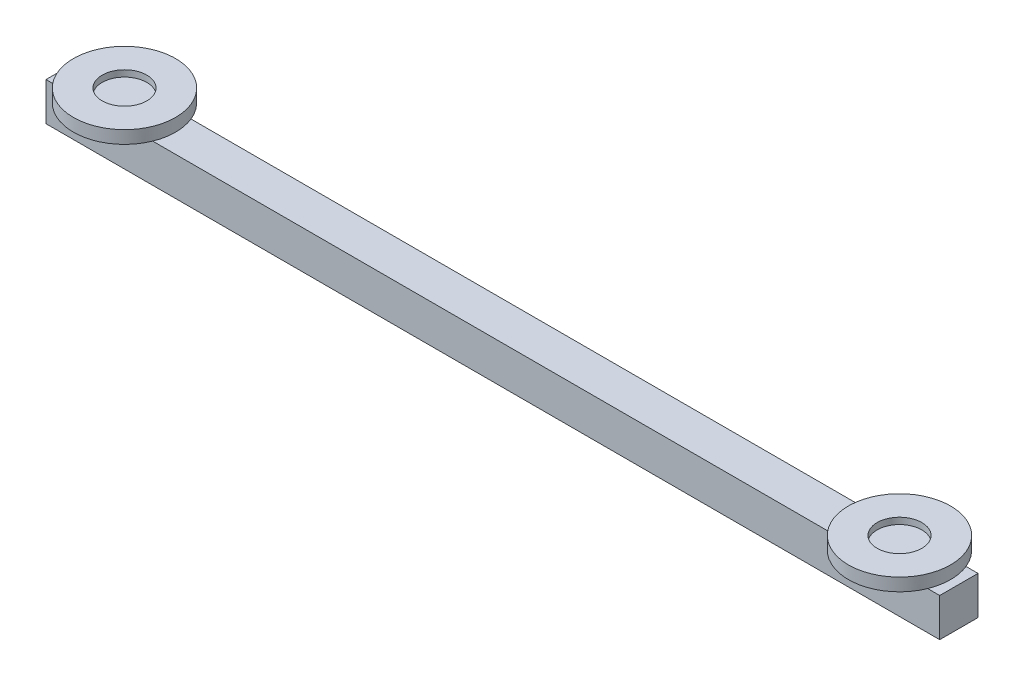
ISO-10303-21;
HEADER;
FILE_DESCRIPTION(('STEP AP214'),'2;1');
FILE_NAME('part.step','',(''),(''),'','','');
FILE_SCHEMA(('AUTOMOTIVE_DESIGN { 1 0 10303 214 1 1 1 1 }'));
ENDSEC;
DATA;
#1=APPLICATION_CONTEXT('core data for automotive mechanical design processes');
#2=APPLICATION_PROTOCOL_DEFINITION('international standard','automotive_design',2000,#1);
#3=PRODUCT_CONTEXT('',#1,'mechanical');
#4=PRODUCT('Part','Part','',(#3));
#5=PRODUCT_RELATED_PRODUCT_CATEGORY('part','',(#4));
#6=PRODUCT_DEFINITION_FORMATION('','',#4);
#7=PRODUCT_DEFINITION_CONTEXT('part definition',#1,'design');
#8=PRODUCT_DEFINITION('design','',#6,#7);
#9=PRODUCT_DEFINITION_SHAPE('','',#8);
#10=(LENGTH_UNIT() NAMED_UNIT(*) SI_UNIT(.MILLI.,.METRE.));
#11=(NAMED_UNIT(*) PLANE_ANGLE_UNIT() SI_UNIT($,.RADIAN.));
#12=(NAMED_UNIT(*) SI_UNIT($,.STERADIAN.) SOLID_ANGLE_UNIT());
#13=UNCERTAINTY_MEASURE_WITH_UNIT(LENGTH_MEASURE(1.E-05),#10,'distance_accuracy_value','');
#14=(GEOMETRIC_REPRESENTATION_CONTEXT(3) GLOBAL_UNCERTAINTY_ASSIGNED_CONTEXT((#13)) GLOBAL_UNIT_ASSIGNED_CONTEXT((#10,
#11,#12)) REPRESENTATION_CONTEXT('',''));
#15=CARTESIAN_POINT('',(0.,0.,0.));
#16=DIRECTION('',(0.,0.,1.));
#17=DIRECTION('',(1.,0.,0.));
#18=AXIS2_PLACEMENT_3D('',#15,#16,#17);
#19=CARTESIAN_POINT('',(350.,15.,15.));
#20=DIRECTION('',(0.,-1.,0.));
#21=DIRECTION('',(0.,0.,-1.));
#22=AXIS2_PLACEMENT_3D('',#19,#20,#21);
#23=PLANE('',#22);
#24=DIRECTION('',(-1.,0.,0.));
#25=VECTOR('',#24,1.);
#26=CARTESIAN_POINT('',(350.,15.,-15.));
#27=LINE('',#26,#25);
#28=CARTESIAN_POINT('',(266.433528067169,15.,-15.));
#29=VERTEX_POINT('',#28);
#30=CARTESIAN_POINT('',(-266.433528067169,15.,-15.));
#31=VERTEX_POINT('',#30);
#32=EDGE_CURVE('E128',#29,#31,#27,.T.);
#33=ORIENTED_EDGE('',*,*,#32,.T.);
#34=CARTESIAN_POINT('',(-303.514520502647,15.,0.));
#35=DIRECTION('',(0.,-1.,0.));
#36=DIRECTION('',(0.,0.,1.));
#37=AXIS2_PLACEMENT_3D('',#34,#35,#36);
#38=CIRCLE('',#37,40.);
#39=CARTESIAN_POINT('',(-266.433528067169,15.,15.));
#40=VERTEX_POINT('',#39);
#41=EDGE_CURVE('E113',#31,#40,#38,.T.);
#42=ORIENTED_EDGE('',*,*,#41,.T.);
#43=DIRECTION('',(-1.,0.,0.));
#44=VECTOR('',#43,1.);
#45=CARTESIAN_POINT('',(350.,15.,15.));
#46=LINE('',#45,#44);
#47=CARTESIAN_POINT('',(266.433528067169,15.,15.));
#48=VERTEX_POINT('',#47);
#49=EDGE_CURVE('E177',#48,#40,#46,.T.);
#50=ORIENTED_EDGE('',*,*,#49,.F.);
#51=CARTESIAN_POINT('',(303.514520502647,15.,0.));
#52=DIRECTION('',(0.,1.,0.));
#53=DIRECTION('',(0.,0.,1.));
#54=AXIS2_PLACEMENT_3D('',#51,#52,#53);
#55=CIRCLE('',#54,40.);
#56=EDGE_CURVE('E11',#29,#48,#55,.T.);
#57=ORIENTED_EDGE('',*,*,#56,.F.);
#58=EDGE_LOOP('',(#33,#42,#50,#57));
#59=FACE_BOUND('',#58,.T.);
#60=ADVANCED_FACE('F33',(#59),#23,.F.);
#61=CARTESIAN_POINT('',(340.595512938126,15.,15.));
#62=VERTEX_POINT('',#61);
#63=CARTESIAN_POINT('',(340.595512938126,15.,-15.));
#64=VERTEX_POINT('',#63);
#65=EDGE_CURVE('E43',#62,#64,#55,.T.);
#66=ORIENTED_EDGE('',*,*,#65,.F.);
#67=CARTESIAN_POINT('',(350.,15.,15.));
#68=VERTEX_POINT('',#67);
#69=EDGE_CURVE('E129',#68,#62,#46,.T.);
#70=ORIENTED_EDGE('',*,*,#69,.F.);
#71=DIRECTION('',(0.,0.,1.));
#72=VECTOR('',#71,1.);
#73=CARTESIAN_POINT('',(350.,15.,15.));
#74=LINE('',#73,#72);
#75=CARTESIAN_POINT('',(350.,15.,-15.));
#76=VERTEX_POINT('',#75);
#77=EDGE_CURVE('E154',#76,#68,#74,.T.);
#78=ORIENTED_EDGE('',*,*,#77,.F.);
#79=EDGE_CURVE('E37',#76,#64,#27,.T.);
#80=ORIENTED_EDGE('',*,*,#79,.T.);
#81=EDGE_LOOP('',(#66,#70,#78,#80));
#82=FACE_BOUND('',#81,.T.);
#83=ADVANCED_FACE('F203',(#82),#23,.F.);
#84=CARTESIAN_POINT('',(350.,-15.,-15.));
#85=DIRECTION('',(0.,0.,1.));
#86=DIRECTION('',(1.,0.,0.));
#87=AXIS2_PLACEMENT_3D('',#84,#85,#86);
#88=PLANE('',#87);
#89=DIRECTION('',(0.,1.,0.));
#90=VECTOR('',#89,1.);
#91=CARTESIAN_POINT('',(-350.,-15.,-15.));
#92=LINE('',#91,#90);
#93=CARTESIAN_POINT('',(-350.,-15.,-15.));
#94=VERTEX_POINT('',#93);
#95=CARTESIAN_POINT('',(-350.,15.,-15.));
#96=VERTEX_POINT('',#95);
#97=EDGE_CURVE('E127',#94,#96,#92,.T.);
#98=ORIENTED_EDGE('',*,*,#97,.T.);
#99=CARTESIAN_POINT('',(-340.595512938126,15.,-15.));
#100=VERTEX_POINT('',#99);
#101=EDGE_CURVE('E119',#100,#96,#27,.T.);
#102=ORIENTED_EDGE('',*,*,#101,.F.);
#103=DIRECTION('',(-1.,0.,0.));
#104=VECTOR('',#103,1.);
#105=CARTESIAN_POINT('',(350.,15.,-15.));
#106=LINE('',#105,#104);
#107=EDGE_CURVE('E103',#31,#100,#106,.T.);
#108=ORIENTED_EDGE('',*,*,#107,.F.);
#109=ORIENTED_EDGE('',*,*,#32,.F.);
#110=EDGE_CURVE('E130',#64,#29,#27,.T.);
#111=ORIENTED_EDGE('',*,*,#110,.F.);
#112=ORIENTED_EDGE('',*,*,#79,.F.);
#113=DIRECTION('',(0.,1.,0.));
#114=VECTOR('',#113,1.);
#115=CARTESIAN_POINT('',(350.,-15.,-15.));
#116=LINE('',#115,#114);
#117=CARTESIAN_POINT('',(350.,-15.,-15.));
#118=VERTEX_POINT('',#117);
#119=EDGE_CURVE('E151',#118,#76,#116,.T.);
#120=ORIENTED_EDGE('',*,*,#119,.F.);
#121=DIRECTION('',(-1.,0.,0.));
#122=VECTOR('',#121,1.);
#123=CARTESIAN_POINT('',(350.,-15.,-15.));
#124=LINE('',#123,#122);
#125=EDGE_CURVE('E161',#118,#94,#124,.T.);
#126=ORIENTED_EDGE('',*,*,#125,.T.);
#127=EDGE_LOOP('',(#98,#102,#108,#109,#111,#112,#120,#126));
#128=FACE_BOUND('',#127,.T.);
#129=ADVANCED_FACE('F35',(#128),#88,.F.);
#130=CARTESIAN_POINT('',(-340.595512938126,15.,15.));
#131=VERTEX_POINT('',#130);
#132=CARTESIAN_POINT('',(-350.,15.,15.));
#133=VERTEX_POINT('',#132);
#134=EDGE_CURVE('E121',#131,#133,#46,.T.);
#135=ORIENTED_EDGE('',*,*,#134,.F.);
#136=EDGE_CURVE('E51',#131,#100,#38,.T.);
#137=ORIENTED_EDGE('',*,*,#136,.T.);
#138=ORIENTED_EDGE('',*,*,#101,.T.);
#139=DIRECTION('',(0.,0.,1.));
#140=VECTOR('',#139,1.);
#141=CARTESIAN_POINT('',(-350.,15.,15.));
#142=LINE('',#141,#140);
#143=EDGE_CURVE('E163',#96,#133,#142,.T.);
#144=ORIENTED_EDGE('',*,*,#143,.T.);
#145=EDGE_LOOP('',(#135,#137,#138,#144));
#146=FACE_BOUND('',#145,.T.);
#147=ADVANCED_FACE('F117',(#146),#23,.F.);
#148=CARTESIAN_POINT('',(350.,-15.,15.));
#149=DIRECTION('',(0.,0.,-1.));
#150=DIRECTION('',(-1.,0.,0.));
#151=AXIS2_PLACEMENT_3D('',#148,#149,#150);
#152=PLANE('',#151);
#153=DIRECTION('',(0.,-1.,0.));
#154=VECTOR('',#153,1.);
#155=CARTESIAN_POINT('',(-350.,-15.,15.));
#156=LINE('',#155,#154);
#157=CARTESIAN_POINT('',(-350.,-15.,15.));
#158=VERTEX_POINT('',#157);
#159=EDGE_CURVE('E165',#133,#158,#156,.T.);
#160=ORIENTED_EDGE('',*,*,#159,.T.);
#161=DIRECTION('',(-1.,0.,0.));
#162=VECTOR('',#161,1.);
#163=CARTESIAN_POINT('',(350.,-15.,15.));
#164=LINE('',#163,#162);
#165=CARTESIAN_POINT('',(350.,-15.,15.));
#166=VERTEX_POINT('',#165);
#167=EDGE_CURVE('E169',#166,#158,#164,.T.);
#168=ORIENTED_EDGE('',*,*,#167,.F.);
#169=DIRECTION('',(0.,-1.,0.));
#170=VECTOR('',#169,1.);
#171=CARTESIAN_POINT('',(350.,-15.,15.));
#172=LINE('',#171,#170);
#173=EDGE_CURVE('E157',#68,#166,#172,.T.);
#174=ORIENTED_EDGE('',*,*,#173,.F.);
#175=ORIENTED_EDGE('',*,*,#69,.T.);
#176=EDGE_CURVE('E132',#62,#48,#46,.T.);
#177=ORIENTED_EDGE('',*,*,#176,.T.);
#178=ORIENTED_EDGE('',*,*,#49,.T.);
#179=EDGE_CURVE('E175',#40,#131,#46,.T.);
#180=ORIENTED_EDGE('',*,*,#179,.T.);
#181=ORIENTED_EDGE('',*,*,#134,.T.);
#182=EDGE_LOOP('',(#160,#168,#174,#175,#177,#178,#180,#181));
#183=FACE_BOUND('',#182,.T.);
#184=ADVANCED_FACE('F180',(#183),#152,.F.);
#185=CARTESIAN_POINT('',(350.,-15.,15.));
#186=DIRECTION('',(0.,1.,0.));
#187=DIRECTION('',(0.,0.,1.));
#188=AXIS2_PLACEMENT_3D('',#185,#186,#187);
#189=PLANE('',#188);
#190=DIRECTION('',(0.,0.,-1.));
#191=VECTOR('',#190,1.);
#192=CARTESIAN_POINT('',(-350.,-15.,15.));
#193=LINE('',#192,#191);
#194=EDGE_CURVE('E155',#158,#94,#193,.T.);
#195=ORIENTED_EDGE('',*,*,#194,.T.);
#196=ORIENTED_EDGE('',*,*,#125,.F.);
#197=DIRECTION('',(0.,0.,-1.));
#198=VECTOR('',#197,1.);
#199=CARTESIAN_POINT('',(350.,-15.,15.));
#200=LINE('',#199,#198);
#201=EDGE_CURVE('E159',#166,#118,#200,.T.);
#202=ORIENTED_EDGE('',*,*,#201,.F.);
#203=ORIENTED_EDGE('',*,*,#167,.T.);
#204=EDGE_LOOP('',(#195,#196,#202,#203));
#205=FACE_BOUND('',#204,.T.);
#206=ADVANCED_FACE('F213',(#205),#189,.F.);
#207=CARTESIAN_POINT('',(350.,0.,0.));
#208=DIRECTION('',(-1.,0.,0.));
#209=DIRECTION('',(0.,0.,1.));
#210=AXIS2_PLACEMENT_3D('',#207,#208,#209);
#211=PLANE('',#210);
#212=ORIENTED_EDGE('',*,*,#119,.T.);
#213=ORIENTED_EDGE('',*,*,#77,.T.);
#214=ORIENTED_EDGE('',*,*,#173,.T.);
#215=ORIENTED_EDGE('',*,*,#201,.T.);
#216=EDGE_LOOP('',(#212,#213,#214,#215));
#217=FACE_BOUND('',#216,.T.);
#218=ADVANCED_FACE('F367',(#217),#211,.F.);
#219=CARTESIAN_POINT('',(-350.,0.,0.));
#220=DIRECTION('',(-1.,0.,0.));
#221=DIRECTION('',(0.,0.,1.));
#222=AXIS2_PLACEMENT_3D('',#219,#220,#221);
#223=PLANE('',#222);
#224=ORIENTED_EDGE('',*,*,#97,.F.);
#225=ORIENTED_EDGE('',*,*,#194,.F.);
#226=ORIENTED_EDGE('',*,*,#159,.F.);
#227=ORIENTED_EDGE('',*,*,#143,.F.);
#228=EDGE_LOOP('',(#224,#225,#226,#227));
#229=FACE_BOUND('',#228,.T.);
#230=ADVANCED_FACE('F201',(#229),#223,.T.);
#231=CARTESIAN_POINT('',(303.514520502647,15.,0.));
#232=DIRECTION('',(0.,1.,0.));
#233=DIRECTION('',(0.,0.,1.));
#234=AXIS2_PLACEMENT_3D('',#231,#232,#233);
#235=PLANE('',#234);
#236=EDGE_CURVE('E44',#64,#29,#55,.T.);
#237=ORIENTED_EDGE('',*,*,#236,.F.);
#238=ORIENTED_EDGE('',*,*,#110,.T.);
#239=EDGE_LOOP('',(#237,#238));
#240=FACE_BOUND('',#239,.T.);
#241=ADVANCED_FACE('F140',(#240),#235,.F.);
#242=CARTESIAN_POINT('',(303.514520502647,25.,0.));
#243=DIRECTION('',(0.,-1.,0.));
#244=DIRECTION('',(0.,0.,-1.));
#245=AXIS2_PLACEMENT_3D('',#242,#243,#244);
#246=CYLINDRICAL_SURFACE('',#245,40.);
#247=CARTESIAN_POINT('',(303.514520502647,25.,0.));
#248=DIRECTION('',(0.,1.,0.));
#249=DIRECTION('',(0.,0.,1.));
#250=AXIS2_PLACEMENT_3D('',#247,#248,#249);
#251=CIRCLE('',#250,40.);
#252=CARTESIAN_POINT('',(303.514520502647,25.,40.));
#253=VERTEX_POINT('',#252);
#254=EDGE_CURVE('E146',#253,#253,#251,.T.);
#255=ORIENTED_EDGE('',*,*,#254,.F.);
#256=EDGE_LOOP('',(#255));
#257=FACE_BOUND('',#256,.T.);
#258=ORIENTED_EDGE('',*,*,#65,.T.);
#259=ORIENTED_EDGE('',*,*,#236,.T.);
#260=ORIENTED_EDGE('',*,*,#56,.T.);
#261=EDGE_CURVE('E145',#48,#62,#55,.T.);
#262=ORIENTED_EDGE('',*,*,#261,.T.);
#263=EDGE_LOOP('',(#258,#259,#260,#262));
#264=FACE_BOUND('',#263,.T.);
#265=ADVANCED_FACE('F143',(#257,#264),#246,.T.);
#266=CARTESIAN_POINT('',(303.514520502647,25.,0.));
#267=DIRECTION('',(0.,1.,0.));
#268=DIRECTION('',(0.,0.,1.));
#269=AXIS2_PLACEMENT_3D('',#266,#267,#268);
#270=PLANE('',#269);
#271=CARTESIAN_POINT('',(303.514520502647,25.,0.));
#272=DIRECTION('',(0.,1.,0.));
#273=DIRECTION('',(0.,0.,1.));
#274=AXIS2_PLACEMENT_3D('',#271,#272,#273);
#275=CIRCLE('',#274,17.5);
#276=CARTESIAN_POINT('',(303.514520502647,25.,17.5));
#277=VERTEX_POINT('',#276);
#278=EDGE_CURVE('E108',#277,#277,#275,.T.);
#279=ORIENTED_EDGE('',*,*,#278,.F.);
#280=EDGE_LOOP('',(#279));
#281=FACE_BOUND('',#280,.T.);
#282=ORIENTED_EDGE('',*,*,#254,.T.);
#283=EDGE_LOOP('',(#282));
#284=FACE_BOUND('',#283,.T.);
#285=ADVANCED_FACE('F188',(#281,#284),#270,.T.);
#286=ORIENTED_EDGE('',*,*,#176,.F.);
#287=ORIENTED_EDGE('',*,*,#261,.F.);
#288=EDGE_LOOP('',(#286,#287));
#289=FACE_BOUND('',#288,.T.);
#290=ADVANCED_FACE('F185',(#289),#235,.F.);
#291=CARTESIAN_POINT('',(303.514520502647,20.,0.));
#292=DIRECTION('',(0.,1.,0.));
#293=DIRECTION('',(0.,0.,1.));
#294=AXIS2_PLACEMENT_3D('',#291,#292,#293);
#295=CYLINDRICAL_SURFACE('',#294,17.5);
#296=CARTESIAN_POINT('',(303.514520502647,20.,0.));
#297=DIRECTION('',(0.,1.,0.));
#298=DIRECTION('',(0.,0.,1.));
#299=AXIS2_PLACEMENT_3D('',#296,#297,#298);
#300=CIRCLE('',#299,17.5);
#301=CARTESIAN_POINT('',(303.514520502647,20.,17.5));
#302=VERTEX_POINT('',#301);
#303=EDGE_CURVE('E147',#302,#302,#300,.T.);
#304=ORIENTED_EDGE('',*,*,#303,.F.);
#305=EDGE_LOOP('',(#304));
#306=FACE_BOUND('',#305,.T.);
#307=ORIENTED_EDGE('',*,*,#278,.T.);
#308=EDGE_LOOP('',(#307));
#309=FACE_BOUND('',#308,.T.);
#310=ADVANCED_FACE('F187',(#306,#309),#295,.F.);
#311=CARTESIAN_POINT('',(303.514520502647,20.,0.));
#312=DIRECTION('',(0.,1.,0.));
#313=DIRECTION('',(0.,0.,1.));
#314=AXIS2_PLACEMENT_3D('',#311,#312,#313);
#315=PLANE('',#314);
#316=ORIENTED_EDGE('',*,*,#303,.T.);
#317=EDGE_LOOP('',(#316));
#318=FACE_BOUND('',#317,.T.);
#319=ADVANCED_FACE('F194',(#318),#315,.T.);
#320=CARTESIAN_POINT('',(-303.514520502647,15.,0.));
#321=DIRECTION('',(0.,1.,0.));
#322=DIRECTION('',(0.,0.,1.));
#323=AXIS2_PLACEMENT_3D('',#320,#321,#322);
#324=PLANE('',#323);
#325=EDGE_CURVE('E105',#100,#31,#38,.T.);
#326=ORIENTED_EDGE('',*,*,#325,.T.);
#327=ORIENTED_EDGE('',*,*,#107,.T.);
#328=EDGE_LOOP('',(#326,#327));
#329=FACE_BOUND('',#328,.T.);
#330=ADVANCED_FACE('F104',(#329),#324,.F.);
#331=EDGE_CURVE('E123',#40,#131,#38,.T.);
#332=ORIENTED_EDGE('',*,*,#331,.T.);
#333=ORIENTED_EDGE('',*,*,#179,.F.);
#334=EDGE_LOOP('',(#332,#333));
#335=FACE_BOUND('',#334,.T.);
#336=ADVANCED_FACE('F278',(#335),#324,.F.);
#337=CARTESIAN_POINT('',(-303.514520502647,25.,0.));
#338=DIRECTION('',(0.,-1.,0.));
#339=DIRECTION('',(0.,0.,-1.));
#340=AXIS2_PLACEMENT_3D('',#337,#338,#339);
#341=CYLINDRICAL_SURFACE('',#340,40.);
#342=CARTESIAN_POINT('',(-303.514520502647,25.,0.));
#343=DIRECTION('',(0.,-1.,0.));
#344=DIRECTION('',(0.,0.,1.));
#345=AXIS2_PLACEMENT_3D('',#342,#343,#344);
#346=CIRCLE('',#345,40.);
#347=CARTESIAN_POINT('',(-303.514520502647,25.,40.));
#348=VERTEX_POINT('',#347);
#349=EDGE_CURVE('E109',#348,#348,#346,.T.);
#350=ORIENTED_EDGE('',*,*,#349,.T.);
#351=EDGE_LOOP('',(#350));
#352=FACE_BOUND('',#351,.T.);
#353=ORIENTED_EDGE('',*,*,#136,.F.);
#354=ORIENTED_EDGE('',*,*,#331,.F.);
#355=ORIENTED_EDGE('',*,*,#41,.F.);
#356=ORIENTED_EDGE('',*,*,#325,.F.);
#357=EDGE_LOOP('',(#353,#354,#355,#356));
#358=FACE_BOUND('',#357,.T.);
#359=ADVANCED_FACE('F111',(#352,#358),#341,.T.);
#360=CARTESIAN_POINT('',(-303.514520502647,25.,0.));
#361=DIRECTION('',(0.,1.,0.));
#362=DIRECTION('',(0.,0.,1.));
#363=AXIS2_PLACEMENT_3D('',#360,#361,#362);
#364=PLANE('',#363);
#365=CARTESIAN_POINT('',(-303.514520502647,25.,0.));
#366=DIRECTION('',(0.,-1.,0.));
#367=DIRECTION('',(0.,0.,1.));
#368=AXIS2_PLACEMENT_3D('',#365,#366,#367);
#369=CIRCLE('',#368,17.5);
#370=CARTESIAN_POINT('',(-303.514520502647,25.,17.5));
#371=VERTEX_POINT('',#370);
#372=EDGE_CURVE('E332',#371,#371,#369,.T.);
#373=ORIENTED_EDGE('',*,*,#372,.T.);
#374=EDGE_LOOP('',(#373));
#375=FACE_BOUND('',#374,.T.);
#376=ORIENTED_EDGE('',*,*,#349,.F.);
#377=EDGE_LOOP('',(#376));
#378=FACE_BOUND('',#377,.T.);
#379=ADVANCED_FACE('F294',(#375,#378),#364,.T.);
#380=CARTESIAN_POINT('',(-303.514520502647,20.,0.));
#381=DIRECTION('',(0.,1.,0.));
#382=DIRECTION('',(0.,0.,1.));
#383=AXIS2_PLACEMENT_3D('',#380,#381,#382);
#384=CYLINDRICAL_SURFACE('',#383,17.5);
#385=CARTESIAN_POINT('',(-303.514520502647,20.,0.));
#386=DIRECTION('',(0.,-1.,0.));
#387=DIRECTION('',(0.,0.,1.));
#388=AXIS2_PLACEMENT_3D('',#385,#386,#387);
#389=CIRCLE('',#388,17.5);
#390=CARTESIAN_POINT('',(-303.514520502647,20.,17.5));
#391=VERTEX_POINT('',#390);
#392=EDGE_CURVE('E331',#391,#391,#389,.T.);
#393=ORIENTED_EDGE('',*,*,#392,.T.);
#394=EDGE_LOOP('',(#393));
#395=FACE_BOUND('',#394,.T.);
#396=ORIENTED_EDGE('',*,*,#372,.F.);
#397=EDGE_LOOP('',(#396));
#398=FACE_BOUND('',#397,.T.);
#399=ADVANCED_FACE('F303',(#395,#398),#384,.F.);
#400=CARTESIAN_POINT('',(-303.514520502647,20.,0.));
#401=DIRECTION('',(0.,1.,0.));
#402=DIRECTION('',(0.,0.,1.));
#403=AXIS2_PLACEMENT_3D('',#400,#401,#402);
#404=PLANE('',#403);
#405=ORIENTED_EDGE('',*,*,#392,.F.);
#406=EDGE_LOOP('',(#405));
#407=FACE_BOUND('',#406,.T.);
#408=ADVANCED_FACE('F312',(#407),#404,.T.);
#409=CLOSED_SHELL('',(#60,#83,#129,#147,#184,#206,#218,#230,#241,#265,#285,#290,#310,#319,#330,
#336,#359,#379,#399,#408));
#410=MANIFOLD_SOLID_BREP('B2',#409);
#411=ADVANCED_BREP_SHAPE_REPRESENTATION('',(#18,#410),#14);
#412=SHAPE_DEFINITION_REPRESENTATION(#9,#411);
ENDSEC;
END-ISO-10303-21;
